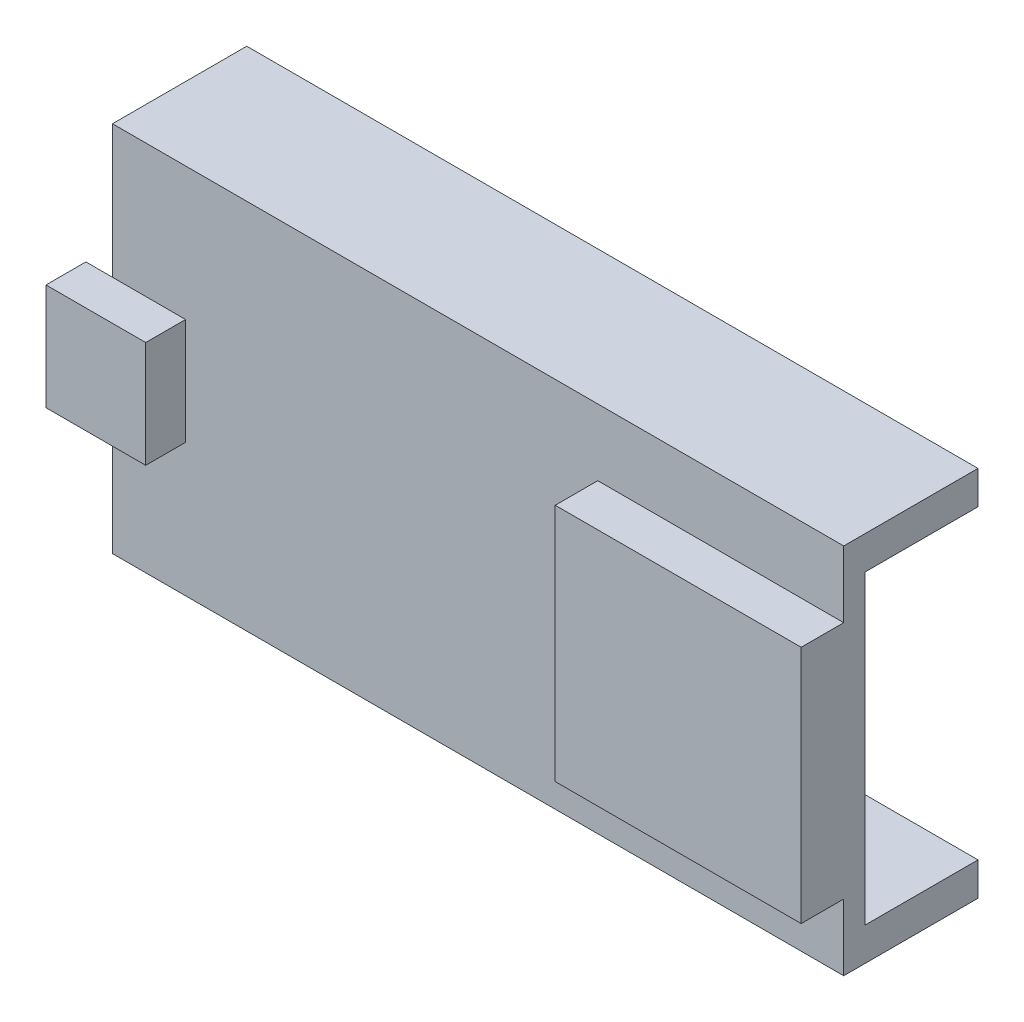
ISO-10303-21;
HEADER;
FILE_DESCRIPTION(('STEP AP214'),'2;1');
FILE_NAME('part.step','',(''),(''),'','','');
FILE_SCHEMA(('AUTOMOTIVE_DESIGN { 1 0 10303 214 1 1 1 1 }'));
ENDSEC;
DATA;
#1=APPLICATION_CONTEXT('core data for automotive mechanical design processes');
#2=APPLICATION_PROTOCOL_DEFINITION('international standard','automotive_design',2000,#1);
#3=PRODUCT_CONTEXT('',#1,'mechanical');
#4=PRODUCT('Part','Part','',(#3));
#5=PRODUCT_RELATED_PRODUCT_CATEGORY('part','',(#4));
#6=PRODUCT_DEFINITION_FORMATION('','',#4);
#7=PRODUCT_DEFINITION_CONTEXT('part definition',#1,'design');
#8=PRODUCT_DEFINITION('design','',#6,#7);
#9=PRODUCT_DEFINITION_SHAPE('','',#8);
#10=(LENGTH_UNIT() NAMED_UNIT(*) SI_UNIT(.MILLI.,.METRE.));
#11=(NAMED_UNIT(*) PLANE_ANGLE_UNIT() SI_UNIT($,.RADIAN.));
#12=(NAMED_UNIT(*) SI_UNIT($,.STERADIAN.) SOLID_ANGLE_UNIT());
#13=UNCERTAINTY_MEASURE_WITH_UNIT(LENGTH_MEASURE(1.E-05),#10,'distance_accuracy_value','');
#14=(GEOMETRIC_REPRESENTATION_CONTEXT(3) GLOBAL_UNCERTAINTY_ASSIGNED_CONTEXT((#13)) GLOBAL_UNIT_ASSIGNED_CONTEXT((#10,
#11,#12)) REPRESENTATION_CONTEXT('',''));
#15=CARTESIAN_POINT('',(0.,0.,0.));
#16=DIRECTION('',(0.,0.,1.));
#17=DIRECTION('',(1.,0.,0.));
#18=AXIS2_PLACEMENT_3D('',#15,#16,#17);
#19=CARTESIAN_POINT('',(-27.5,14.,1.6));
#20=DIRECTION('',(1.,0.,0.));
#21=DIRECTION('',(0.,0.,-1.));
#22=AXIS2_PLACEMENT_3D('',#19,#20,#21);
#23=PLANE('',#22);
#24=DIRECTION('',(0.,0.,-1.));
#25=VECTOR('',#24,1.);
#26=CARTESIAN_POINT('',(-27.5,14.,1.6));
#27=LINE('',#26,#25);
#28=CARTESIAN_POINT('',(-27.5,14.,1.6));
#29=VERTEX_POINT('',#28);
#30=CARTESIAN_POINT('',(-27.5,14.,-8.5));
#31=VERTEX_POINT('',#30);
#32=EDGE_CURVE('E264',#29,#31,#27,.T.);
#33=ORIENTED_EDGE('',*,*,#32,.T.);
#34=DIRECTION('',(0.,-1.,0.));
#35=VECTOR('',#34,1.);
#36=CARTESIAN_POINT('',(-27.5,14.,-8.5));
#37=LINE('',#36,#35);
#38=CARTESIAN_POINT('',(-27.5,11.5,-8.5));
#39=VERTEX_POINT('',#38);
#40=EDGE_CURVE('E213',#31,#39,#37,.T.);
#41=ORIENTED_EDGE('',*,*,#40,.T.);
#42=DIRECTION('',(0.,0.,-1.));
#43=VECTOR('',#42,1.);
#44=CARTESIAN_POINT('',(-27.5,11.5,0.));
#45=LINE('',#44,#43);
#46=CARTESIAN_POINT('',(-27.5,11.5,0.));
#47=VERTEX_POINT('',#46);
#48=EDGE_CURVE('E229',#47,#39,#45,.T.);
#49=ORIENTED_EDGE('',*,*,#48,.F.);
#50=DIRECTION('',(0.,-1.,0.));
#51=VECTOR('',#50,1.);
#52=CARTESIAN_POINT('',(-27.5,14.,0.));
#53=LINE('',#52,#51);
#54=CARTESIAN_POINT('',(-27.5,-11.5,0.));
#55=VERTEX_POINT('',#54);
#56=EDGE_CURVE('E252',#47,#55,#53,.T.);
#57=ORIENTED_EDGE('',*,*,#56,.T.);
#58=DIRECTION('',(0.,0.,-1.));
#59=VECTOR('',#58,1.);
#60=CARTESIAN_POINT('',(-27.5,-11.5,0.));
#61=LINE('',#60,#59);
#62=CARTESIAN_POINT('',(-27.5,-11.5,-8.5));
#63=VERTEX_POINT('',#62);
#64=EDGE_CURVE('E240',#55,#63,#61,.T.);
#65=ORIENTED_EDGE('',*,*,#64,.T.);
#66=DIRECTION('',(0.,-1.,0.));
#67=VECTOR('',#66,1.);
#68=CARTESIAN_POINT('',(-27.5,-11.5,-8.5));
#69=LINE('',#68,#67);
#70=CARTESIAN_POINT('',(-27.5,-14.,-8.5));
#71=VERTEX_POINT('',#70);
#72=EDGE_CURVE('E234',#63,#71,#69,.T.);
#73=ORIENTED_EDGE('',*,*,#72,.T.);
#74=DIRECTION('',(0.,0.,-1.));
#75=VECTOR('',#74,1.);
#76=CARTESIAN_POINT('',(-27.5,-14.,1.6));
#77=LINE('',#76,#75);
#78=CARTESIAN_POINT('',(-27.5,-14.,1.6));
#79=VERTEX_POINT('',#78);
#80=EDGE_CURVE('E45',#79,#71,#77,.T.);
#81=ORIENTED_EDGE('',*,*,#80,.F.);
#82=DIRECTION('',(0.,-1.,0.));
#83=VECTOR('',#82,1.);
#84=CARTESIAN_POINT('',(-27.5,14.,1.6));
#85=LINE('',#84,#83);
#86=CARTESIAN_POINT('',(-27.5,-4.,1.6));
#87=VERTEX_POINT('',#86);
#88=EDGE_CURVE('E256',#87,#79,#85,.T.);
#89=ORIENTED_EDGE('',*,*,#88,.F.);
#90=CARTESIAN_POINT('',(-27.5,4.,1.6));
#91=VERTEX_POINT('',#90);
#92=EDGE_CURVE('E260',#91,#87,#85,.T.);
#93=ORIENTED_EDGE('',*,*,#92,.F.);
#94=EDGE_CURVE('E251',#29,#91,#85,.T.);
#95=ORIENTED_EDGE('',*,*,#94,.F.);
#96=EDGE_LOOP('',(#33,#41,#49,#57,#65,#73,#81,#89,#93,#95));
#97=FACE_BOUND('',#96,.T.);
#98=ADVANCED_FACE('F39',(#97),#23,.F.);
#99=CARTESIAN_POINT('',(-27.5,-14.,1.6));
#100=DIRECTION('',(0.,1.,0.));
#101=DIRECTION('',(0.,0.,1.));
#102=AXIS2_PLACEMENT_3D('',#99,#100,#101);
#103=PLANE('',#102);
#104=ORIENTED_EDGE('',*,*,#80,.T.);
#105=DIRECTION('',(1.,0.,0.));
#106=VECTOR('',#105,1.);
#107=CARTESIAN_POINT('',(-27.5,-14.,-8.5));
#108=LINE('',#107,#106);
#109=CARTESIAN_POINT('',(27.5,-14.,-8.5));
#110=VERTEX_POINT('',#109);
#111=EDGE_CURVE('E241',#71,#110,#108,.T.);
#112=ORIENTED_EDGE('',*,*,#111,.T.);
#113=DIRECTION('',(0.,0.,-1.));
#114=VECTOR('',#113,1.);
#115=CARTESIAN_POINT('',(27.5,-14.,1.6));
#116=LINE('',#115,#114);
#117=CARTESIAN_POINT('',(27.5,-14.,1.6));
#118=VERTEX_POINT('',#117);
#119=EDGE_CURVE('E275',#118,#110,#116,.T.);
#120=ORIENTED_EDGE('',*,*,#119,.F.);
#121=DIRECTION('',(1.,0.,0.));
#122=VECTOR('',#121,1.);
#123=CARTESIAN_POINT('',(-27.5,-14.,1.6));
#124=LINE('',#123,#122);
#125=EDGE_CURVE('E258',#79,#118,#124,.T.);
#126=ORIENTED_EDGE('',*,*,#125,.F.);
#127=EDGE_LOOP('',(#104,#112,#120,#126));
#128=FACE_BOUND('',#127,.T.);
#129=ADVANCED_FACE('F278',(#128),#103,.F.);
#130=CARTESIAN_POINT('',(27.5,-14.,1.6));
#131=DIRECTION('',(-1.,0.,0.));
#132=DIRECTION('',(0.,0.,1.));
#133=AXIS2_PLACEMENT_3D('',#130,#131,#132);
#134=PLANE('',#133);
#135=ORIENTED_EDGE('',*,*,#119,.T.);
#136=DIRECTION('',(0.,1.,0.));
#137=VECTOR('',#136,1.);
#138=CARTESIAN_POINT('',(27.5,-14.,-8.5));
#139=LINE('',#138,#137);
#140=CARTESIAN_POINT('',(27.5,-11.5,-8.5));
#141=VERTEX_POINT('',#140);
#142=EDGE_CURVE('E243',#110,#141,#139,.T.);
#143=ORIENTED_EDGE('',*,*,#142,.T.);
#144=DIRECTION('',(0.,0.,-1.));
#145=VECTOR('',#144,1.);
#146=CARTESIAN_POINT('',(27.5,-11.5,0.));
#147=LINE('',#146,#145);
#148=CARTESIAN_POINT('',(27.5,-11.5,0.));
#149=VERTEX_POINT('',#148);
#150=EDGE_CURVE('E246',#149,#141,#147,.T.);
#151=ORIENTED_EDGE('',*,*,#150,.F.);
#152=DIRECTION('',(0.,1.,0.));
#153=VECTOR('',#152,1.);
#154=CARTESIAN_POINT('',(27.5,-14.,0.));
#155=LINE('',#154,#153);
#156=CARTESIAN_POINT('',(27.5,11.5,0.));
#157=VERTEX_POINT('',#156);
#158=EDGE_CURVE('E270',#149,#157,#155,.T.);
#159=ORIENTED_EDGE('',*,*,#158,.T.);
#160=DIRECTION('',(0.,0.,-1.));
#161=VECTOR('',#160,1.);
#162=CARTESIAN_POINT('',(27.5,11.5,0.));
#163=LINE('',#162,#161);
#164=CARTESIAN_POINT('',(27.5,11.5,-8.5));
#165=VERTEX_POINT('',#164);
#166=EDGE_CURVE('E220',#157,#165,#163,.T.);
#167=ORIENTED_EDGE('',*,*,#166,.T.);
#168=DIRECTION('',(0.,1.,0.));
#169=VECTOR('',#168,1.);
#170=CARTESIAN_POINT('',(27.5,11.5,-8.5));
#171=LINE('',#170,#169);
#172=CARTESIAN_POINT('',(27.5,14.,-8.5));
#173=VERTEX_POINT('',#172);
#174=EDGE_CURVE('E224',#165,#173,#171,.T.);
#175=ORIENTED_EDGE('',*,*,#174,.T.);
#176=DIRECTION('',(0.,0.,-1.));
#177=VECTOR('',#176,1.);
#178=CARTESIAN_POINT('',(27.5,14.,1.6));
#179=LINE('',#178,#177);
#180=CARTESIAN_POINT('',(27.5,14.,1.6));
#181=VERTEX_POINT('',#180);
#182=EDGE_CURVE('E271',#181,#173,#179,.T.);
#183=ORIENTED_EDGE('',*,*,#182,.F.);
#184=DIRECTION('',(0.,1.,0.));
#185=VECTOR('',#184,1.);
#186=CARTESIAN_POINT('',(27.5,-14.,1.6));
#187=LINE('',#186,#185);
#188=CARTESIAN_POINT('',(27.5,9.,1.6));
#189=VERTEX_POINT('',#188);
#190=EDGE_CURVE('E257',#189,#181,#187,.T.);
#191=ORIENTED_EDGE('',*,*,#190,.F.);
#192=DIRECTION('',(0.,0.,-1.));
#193=VECTOR('',#192,1.);
#194=CARTESIAN_POINT('',(27.5,9.,4.8));
#195=LINE('',#194,#193);
#196=CARTESIAN_POINT('',(27.5,9.,4.8));
#197=VERTEX_POINT('',#196);
#198=EDGE_CURVE('E204',#197,#189,#195,.T.);
#199=ORIENTED_EDGE('',*,*,#198,.F.);
#200=DIRECTION('',(0.,1.,0.));
#201=VECTOR('',#200,1.);
#202=CARTESIAN_POINT('',(27.5,-9.,4.8));
#203=LINE('',#202,#201);
#204=CARTESIAN_POINT('',(27.5,-9.,4.8));
#205=VERTEX_POINT('',#204);
#206=EDGE_CURVE('E191',#205,#197,#203,.T.);
#207=ORIENTED_EDGE('',*,*,#206,.F.);
#208=DIRECTION('',(0.,0.,-1.));
#209=VECTOR('',#208,1.);
#210=CARTESIAN_POINT('',(27.5,-9.,4.8));
#211=LINE('',#210,#209);
#212=CARTESIAN_POINT('',(27.5,-9.,1.6));
#213=VERTEX_POINT('',#212);
#214=EDGE_CURVE('E210',#205,#213,#211,.T.);
#215=ORIENTED_EDGE('',*,*,#214,.T.);
#216=EDGE_CURVE('E261',#118,#213,#187,.T.);
#217=ORIENTED_EDGE('',*,*,#216,.F.);
#218=EDGE_LOOP('',(#135,#143,#151,#159,#167,#175,#183,#191,#199,#207,#215,#217));
#219=FACE_BOUND('',#218,.T.);
#220=ADVANCED_FACE('F300',(#219),#134,.F.);
#221=CARTESIAN_POINT('',(27.5,14.,1.6));
#222=DIRECTION('',(0.,-1.,0.));
#223=DIRECTION('',(0.,0.,-1.));
#224=AXIS2_PLACEMENT_3D('',#221,#222,#223);
#225=PLANE('',#224);
#226=ORIENTED_EDGE('',*,*,#182,.T.);
#227=DIRECTION('',(-1.,0.,0.));
#228=VECTOR('',#227,1.);
#229=CARTESIAN_POINT('',(27.5,14.,-8.5));
#230=LINE('',#229,#228);
#231=EDGE_CURVE('E217',#173,#31,#230,.T.);
#232=ORIENTED_EDGE('',*,*,#231,.T.);
#233=ORIENTED_EDGE('',*,*,#32,.F.);
#234=DIRECTION('',(-1.,0.,0.));
#235=VECTOR('',#234,1.);
#236=CARTESIAN_POINT('',(27.5,14.,1.6));
#237=LINE('',#236,#235);
#238=EDGE_CURVE('E263',#181,#29,#237,.T.);
#239=ORIENTED_EDGE('',*,*,#238,.F.);
#240=EDGE_LOOP('',(#226,#232,#233,#239));
#241=FACE_BOUND('',#240,.T.);
#242=ADVANCED_FACE('F307',(#241),#225,.F.);
#243=CARTESIAN_POINT('',(0.,0.,1.6));
#244=DIRECTION('',(0.,0.,1.));
#245=DIRECTION('',(1.,0.,0.));
#246=AXIS2_PLACEMENT_3D('',#243,#244,#245);
#247=PLANE('',#246);
#248=DIRECTION('',(-1.,0.,0.));
#249=VECTOR('',#248,1.);
#250=CARTESIAN_POINT('',(-22.,4.,1.6));
#251=LINE('',#250,#249);
#252=CARTESIAN_POINT('',(-22.,4.,1.6));
#253=VERTEX_POINT('',#252);
#254=EDGE_CURVE('E177',#253,#91,#251,.T.);
#255=ORIENTED_EDGE('',*,*,#254,.F.);
#256=DIRECTION('',(0.,1.,0.));
#257=VECTOR('',#256,1.);
#258=CARTESIAN_POINT('',(-22.,-4.,1.6));
#259=LINE('',#258,#257);
#260=CARTESIAN_POINT('',(-22.,-4.,1.6));
#261=VERTEX_POINT('',#260);
#262=EDGE_CURVE('E334',#261,#253,#259,.T.);
#263=ORIENTED_EDGE('',*,*,#262,.F.);
#264=DIRECTION('',(1.,0.,0.));
#265=VECTOR('',#264,1.);
#266=CARTESIAN_POINT('',(-29.5,-4.,1.6));
#267=LINE('',#266,#265);
#268=EDGE_CURVE('E11',#87,#261,#267,.T.);
#269=ORIENTED_EDGE('',*,*,#268,.F.);
#270=ORIENTED_EDGE('',*,*,#88,.T.);
#271=ORIENTED_EDGE('',*,*,#125,.T.);
#272=ORIENTED_EDGE('',*,*,#216,.T.);
#273=DIRECTION('',(1.,0.,0.));
#274=VECTOR('',#273,1.);
#275=CARTESIAN_POINT('',(9.,-9.,1.6));
#276=LINE('',#275,#274);
#277=CARTESIAN_POINT('',(9.,-9.,1.6));
#278=VERTEX_POINT('',#277);
#279=EDGE_CURVE('E185',#278,#213,#276,.T.);
#280=ORIENTED_EDGE('',*,*,#279,.F.);
#281=DIRECTION('',(0.,-1.,0.));
#282=VECTOR('',#281,1.);
#283=CARTESIAN_POINT('',(9.,9.,1.6));
#284=LINE('',#283,#282);
#285=CARTESIAN_POINT('',(9.,9.,1.6));
#286=VERTEX_POINT('',#285);
#287=EDGE_CURVE('E65',#286,#278,#284,.T.);
#288=ORIENTED_EDGE('',*,*,#287,.F.);
#289=DIRECTION('',(-1.,0.,0.));
#290=VECTOR('',#289,1.);
#291=CARTESIAN_POINT('',(27.5,9.,1.6));
#292=LINE('',#291,#290);
#293=EDGE_CURVE('E195',#189,#286,#292,.T.);
#294=ORIENTED_EDGE('',*,*,#293,.F.);
#295=ORIENTED_EDGE('',*,*,#190,.T.);
#296=ORIENTED_EDGE('',*,*,#238,.T.);
#297=ORIENTED_EDGE('',*,*,#94,.T.);
#298=EDGE_LOOP('',(#255,#263,#269,#270,#271,#272,#280,#288,#294,#295,#296,#297));
#299=FACE_BOUND('',#298,.T.);
#300=ADVANCED_FACE('F324',(#299),#247,.T.);
#301=CARTESIAN_POINT('',(0.,0.,0.));
#302=DIRECTION('',(0.,0.,1.));
#303=DIRECTION('',(1.,0.,0.));
#304=AXIS2_PLACEMENT_3D('',#301,#302,#303);
#305=PLANE('',#304);
#306=ORIENTED_EDGE('',*,*,#56,.F.);
#307=DIRECTION('',(1.,0.,0.));
#308=VECTOR('',#307,1.);
#309=CARTESIAN_POINT('',(-27.5,11.5,0.));
#310=LINE('',#309,#308);
#311=EDGE_CURVE('E212',#47,#157,#310,.T.);
#312=ORIENTED_EDGE('',*,*,#311,.T.);
#313=ORIENTED_EDGE('',*,*,#158,.F.);
#314=DIRECTION('',(-1.,0.,0.));
#315=VECTOR('',#314,1.);
#316=CARTESIAN_POINT('',(27.5,-11.5,0.));
#317=LINE('',#316,#315);
#318=EDGE_CURVE('E231',#149,#55,#317,.T.);
#319=ORIENTED_EDGE('',*,*,#318,.T.);
#320=EDGE_LOOP('',(#306,#312,#313,#319));
#321=FACE_BOUND('',#320,.T.);
#322=ADVANCED_FACE('F296',(#321),#305,.F.);
#323=CARTESIAN_POINT('',(27.5,-11.5,0.));
#324=DIRECTION('',(0.,-1.,0.));
#325=DIRECTION('',(0.,0.,-1.));
#326=AXIS2_PLACEMENT_3D('',#323,#324,#325);
#327=PLANE('',#326);
#328=DIRECTION('',(-1.,0.,0.));
#329=VECTOR('',#328,1.);
#330=CARTESIAN_POINT('',(27.5,-11.5,-8.5));
#331=LINE('',#330,#329);
#332=EDGE_CURVE('E236',#141,#63,#331,.T.);
#333=ORIENTED_EDGE('',*,*,#332,.T.);
#334=ORIENTED_EDGE('',*,*,#64,.F.);
#335=ORIENTED_EDGE('',*,*,#318,.F.);
#336=ORIENTED_EDGE('',*,*,#150,.T.);
#337=EDGE_LOOP('',(#333,#334,#335,#336));
#338=FACE_BOUND('',#337,.T.);
#339=ADVANCED_FACE('F291',(#338),#327,.F.);
#340=CARTESIAN_POINT('',(0.,0.,-8.5));
#341=DIRECTION('',(0.,0.,1.));
#342=DIRECTION('',(1.,0.,0.));
#343=AXIS2_PLACEMENT_3D('',#340,#341,#342);
#344=PLANE('',#343);
#345=ORIENTED_EDGE('',*,*,#72,.F.);
#346=ORIENTED_EDGE('',*,*,#332,.F.);
#347=ORIENTED_EDGE('',*,*,#142,.F.);
#348=ORIENTED_EDGE('',*,*,#111,.F.);
#349=EDGE_LOOP('',(#345,#346,#347,#348));
#350=FACE_BOUND('',#349,.T.);
#351=ADVANCED_FACE('F287',(#350),#344,.F.);
#352=CARTESIAN_POINT('',(-27.5,11.5,0.));
#353=DIRECTION('',(0.,1.,0.));
#354=DIRECTION('',(0.,0.,1.));
#355=AXIS2_PLACEMENT_3D('',#352,#353,#354);
#356=PLANE('',#355);
#357=DIRECTION('',(1.,0.,0.));
#358=VECTOR('',#357,1.);
#359=CARTESIAN_POINT('',(-27.5,11.5,-8.5));
#360=LINE('',#359,#358);
#361=EDGE_CURVE('E222',#39,#165,#360,.T.);
#362=ORIENTED_EDGE('',*,*,#361,.T.);
#363=ORIENTED_EDGE('',*,*,#166,.F.);
#364=ORIENTED_EDGE('',*,*,#311,.F.);
#365=ORIENTED_EDGE('',*,*,#48,.T.);
#366=EDGE_LOOP('',(#362,#363,#364,#365));
#367=FACE_BOUND('',#366,.T.);
#368=ADVANCED_FACE('F341',(#367),#356,.F.);
#369=CARTESIAN_POINT('',(0.,0.,-8.5));
#370=DIRECTION('',(0.,0.,1.));
#371=DIRECTION('',(1.,0.,0.));
#372=AXIS2_PLACEMENT_3D('',#369,#370,#371);
#373=PLANE('',#372);
#374=ORIENTED_EDGE('',*,*,#40,.F.);
#375=ORIENTED_EDGE('',*,*,#231,.F.);
#376=ORIENTED_EDGE('',*,*,#174,.F.);
#377=ORIENTED_EDGE('',*,*,#361,.F.);
#378=EDGE_LOOP('',(#374,#375,#376,#377));
#379=FACE_BOUND('',#378,.T.);
#380=ADVANCED_FACE('F301',(#379),#373,.F.);
#381=CARTESIAN_POINT('',(9.,9.,4.8));
#382=DIRECTION('',(1.,0.,0.));
#383=DIRECTION('',(0.,0.,-1.));
#384=AXIS2_PLACEMENT_3D('',#381,#382,#383);
#385=PLANE('',#384);
#386=ORIENTED_EDGE('',*,*,#287,.T.);
#387=DIRECTION('',(0.,0.,-1.));
#388=VECTOR('',#387,1.);
#389=CARTESIAN_POINT('',(9.,-9.,4.8));
#390=LINE('',#389,#388);
#391=CARTESIAN_POINT('',(9.,-9.,4.8));
#392=VERTEX_POINT('',#391);
#393=EDGE_CURVE('E209',#392,#278,#390,.T.);
#394=ORIENTED_EDGE('',*,*,#393,.F.);
#395=DIRECTION('',(0.,-1.,0.));
#396=VECTOR('',#395,1.);
#397=CARTESIAN_POINT('',(9.,9.,4.8));
#398=LINE('',#397,#396);
#399=CARTESIAN_POINT('',(9.,9.,4.8));
#400=VERTEX_POINT('',#399);
#401=EDGE_CURVE('E187',#400,#392,#398,.T.);
#402=ORIENTED_EDGE('',*,*,#401,.F.);
#403=DIRECTION('',(0.,0.,-1.));
#404=VECTOR('',#403,1.);
#405=CARTESIAN_POINT('',(9.,9.,4.8));
#406=LINE('',#405,#404);
#407=EDGE_CURVE('E197',#400,#286,#406,.T.);
#408=ORIENTED_EDGE('',*,*,#407,.T.);
#409=EDGE_LOOP('',(#386,#394,#402,#408));
#410=FACE_BOUND('',#409,.T.);
#411=ADVANCED_FACE('F351',(#410),#385,.F.);
#412=CARTESIAN_POINT('',(9.,-9.,4.8));
#413=DIRECTION('',(0.,1.,0.));
#414=DIRECTION('',(0.,0.,1.));
#415=AXIS2_PLACEMENT_3D('',#412,#413,#414);
#416=PLANE('',#415);
#417=ORIENTED_EDGE('',*,*,#279,.T.);
#418=ORIENTED_EDGE('',*,*,#214,.F.);
#419=DIRECTION('',(1.,0.,0.));
#420=VECTOR('',#419,1.);
#421=CARTESIAN_POINT('',(9.,-9.,4.8));
#422=LINE('',#421,#420);
#423=EDGE_CURVE('E192',#392,#205,#422,.T.);
#424=ORIENTED_EDGE('',*,*,#423,.F.);
#425=ORIENTED_EDGE('',*,*,#393,.T.);
#426=EDGE_LOOP('',(#417,#418,#424,#425));
#427=FACE_BOUND('',#426,.T.);
#428=ADVANCED_FACE('F323',(#427),#416,.F.);
#429=CARTESIAN_POINT('',(27.5,9.,4.8));
#430=DIRECTION('',(0.,-1.,0.));
#431=DIRECTION('',(0.,0.,-1.));
#432=AXIS2_PLACEMENT_3D('',#429,#430,#431);
#433=PLANE('',#432);
#434=ORIENTED_EDGE('',*,*,#293,.T.);
#435=ORIENTED_EDGE('',*,*,#407,.F.);
#436=DIRECTION('',(-1.,0.,0.));
#437=VECTOR('',#436,1.);
#438=CARTESIAN_POINT('',(27.5,9.,4.8));
#439=LINE('',#438,#437);
#440=EDGE_CURVE('E198',#197,#400,#439,.T.);
#441=ORIENTED_EDGE('',*,*,#440,.F.);
#442=ORIENTED_EDGE('',*,*,#198,.T.);
#443=EDGE_LOOP('',(#434,#435,#441,#442));
#444=FACE_BOUND('',#443,.T.);
#445=ADVANCED_FACE('F312',(#444),#433,.F.);
#446=CARTESIAN_POINT('',(0.,0.,4.8));
#447=DIRECTION('',(0.,0.,1.));
#448=DIRECTION('',(1.,0.,0.));
#449=AXIS2_PLACEMENT_3D('',#446,#447,#448);
#450=PLANE('',#449);
#451=ORIENTED_EDGE('',*,*,#401,.T.);
#452=ORIENTED_EDGE('',*,*,#423,.T.);
#453=ORIENTED_EDGE('',*,*,#206,.T.);
#454=ORIENTED_EDGE('',*,*,#440,.T.);
#455=EDGE_LOOP('',(#451,#452,#453,#454));
#456=FACE_BOUND('',#455,.T.);
#457=ADVANCED_FACE('F317',(#456),#450,.T.);
#458=CARTESIAN_POINT('',(0.,0.,1.6));
#459=DIRECTION('',(0.,0.,1.));
#460=DIRECTION('',(1.,0.,0.));
#461=AXIS2_PLACEMENT_3D('',#458,#459,#460);
#462=PLANE('',#461);
#463=CARTESIAN_POINT('',(-29.5,4.,1.6));
#464=VERTEX_POINT('',#463);
#465=EDGE_CURVE('E332',#91,#464,#251,.T.);
#466=ORIENTED_EDGE('',*,*,#465,.F.);
#467=ORIENTED_EDGE('',*,*,#92,.T.);
#468=CARTESIAN_POINT('',(-29.5,-4.,1.6));
#469=VERTEX_POINT('',#468);
#470=EDGE_CURVE('E48',#469,#87,#267,.T.);
#471=ORIENTED_EDGE('',*,*,#470,.F.);
#472=DIRECTION('',(0.,-1.,0.));
#473=VECTOR('',#472,1.);
#474=CARTESIAN_POINT('',(-29.5,4.,1.6));
#475=LINE('',#474,#473);
#476=EDGE_CURVE('E178',#464,#469,#475,.T.);
#477=ORIENTED_EDGE('',*,*,#476,.F.);
#478=EDGE_LOOP('',(#466,#467,#471,#477));
#479=FACE_BOUND('',#478,.T.);
#480=ADVANCED_FACE('F329',(#479),#462,.F.);
#481=CARTESIAN_POINT('',(-29.5,4.,4.6));
#482=DIRECTION('',(1.,0.,0.));
#483=DIRECTION('',(0.,0.,-1.));
#484=AXIS2_PLACEMENT_3D('',#481,#482,#483);
#485=PLANE('',#484);
#486=ORIENTED_EDGE('',*,*,#476,.T.);
#487=DIRECTION('',(0.,0.,-1.));
#488=VECTOR('',#487,1.);
#489=CARTESIAN_POINT('',(-29.5,-4.,4.6));
#490=LINE('',#489,#488);
#491=CARTESIAN_POINT('',(-29.5,-4.,4.6));
#492=VERTEX_POINT('',#491);
#493=EDGE_CURVE('E162',#492,#469,#490,.T.);
#494=ORIENTED_EDGE('',*,*,#493,.F.);
#495=DIRECTION('',(0.,-1.,0.));
#496=VECTOR('',#495,1.);
#497=CARTESIAN_POINT('',(-29.5,4.,4.6));
#498=LINE('',#497,#496);
#499=CARTESIAN_POINT('',(-29.5,4.,4.6));
#500=VERTEX_POINT('',#499);
#501=EDGE_CURVE('E170',#500,#492,#498,.T.);
#502=ORIENTED_EDGE('',*,*,#501,.F.);
#503=DIRECTION('',(0.,0.,-1.));
#504=VECTOR('',#503,1.);
#505=CARTESIAN_POINT('',(-29.5,4.,4.6));
#506=LINE('',#505,#504);
#507=EDGE_CURVE('E338',#500,#464,#506,.T.);
#508=ORIENTED_EDGE('',*,*,#507,.T.);
#509=EDGE_LOOP('',(#486,#494,#502,#508));
#510=FACE_BOUND('',#509,.T.);
#511=ADVANCED_FACE('F179',(#510),#485,.F.);
#512=CARTESIAN_POINT('',(-29.5,-4.,4.6));
#513=DIRECTION('',(0.,1.,0.));
#514=DIRECTION('',(0.,0.,1.));
#515=AXIS2_PLACEMENT_3D('',#512,#513,#514);
#516=PLANE('',#515);
#517=ORIENTED_EDGE('',*,*,#470,.T.);
#518=ORIENTED_EDGE('',*,*,#268,.T.);
#519=DIRECTION('',(0.,0.,-1.));
#520=VECTOR('',#519,1.);
#521=CARTESIAN_POINT('',(-22.,-4.,4.6));
#522=LINE('',#521,#520);
#523=CARTESIAN_POINT('',(-22.,-4.,4.6));
#524=VERTEX_POINT('',#523);
#525=EDGE_CURVE('E54',#524,#261,#522,.T.);
#526=ORIENTED_EDGE('',*,*,#525,.F.);
#527=DIRECTION('',(1.,0.,0.));
#528=VECTOR('',#527,1.);
#529=CARTESIAN_POINT('',(-29.5,-4.,4.6));
#530=LINE('',#529,#528);
#531=EDGE_CURVE('E158',#492,#524,#530,.T.);
#532=ORIENTED_EDGE('',*,*,#531,.F.);
#533=ORIENTED_EDGE('',*,*,#493,.T.);
#534=EDGE_LOOP('',(#517,#518,#526,#532,#533));
#535=FACE_BOUND('',#534,.T.);
#536=ADVANCED_FACE('F161',(#535),#516,.F.);
#537=CARTESIAN_POINT('',(-22.,-4.,4.6));
#538=DIRECTION('',(-1.,0.,0.));
#539=DIRECTION('',(0.,0.,1.));
#540=AXIS2_PLACEMENT_3D('',#537,#538,#539);
#541=PLANE('',#540);
#542=ORIENTED_EDGE('',*,*,#262,.T.);
#543=DIRECTION('',(0.,0.,-1.));
#544=VECTOR('',#543,1.);
#545=CARTESIAN_POINT('',(-22.,4.,4.6));
#546=LINE('',#545,#544);
#547=CARTESIAN_POINT('',(-22.,4.,4.6));
#548=VERTEX_POINT('',#547);
#549=EDGE_CURVE('E184',#548,#253,#546,.T.);
#550=ORIENTED_EDGE('',*,*,#549,.F.);
#551=DIRECTION('',(0.,1.,0.));
#552=VECTOR('',#551,1.);
#553=CARTESIAN_POINT('',(-22.,-4.,4.6));
#554=LINE('',#553,#552);
#555=EDGE_CURVE('E167',#524,#548,#554,.T.);
#556=ORIENTED_EDGE('',*,*,#555,.F.);
#557=ORIENTED_EDGE('',*,*,#525,.T.);
#558=EDGE_LOOP('',(#542,#550,#556,#557));
#559=FACE_BOUND('',#558,.T.);
#560=ADVANCED_FACE('F483',(#559),#541,.F.);
#561=CARTESIAN_POINT('',(-22.,4.,4.6));
#562=DIRECTION('',(0.,-1.,0.));
#563=DIRECTION('',(0.,0.,-1.));
#564=AXIS2_PLACEMENT_3D('',#561,#562,#563);
#565=PLANE('',#564);
#566=ORIENTED_EDGE('',*,*,#254,.T.);
#567=ORIENTED_EDGE('',*,*,#465,.T.);
#568=ORIENTED_EDGE('',*,*,#507,.F.);
#569=DIRECTION('',(-1.,0.,0.));
#570=VECTOR('',#569,1.);
#571=CARTESIAN_POINT('',(-22.,4.,4.6));
#572=LINE('',#571,#570);
#573=EDGE_CURVE('E175',#548,#500,#572,.T.);
#574=ORIENTED_EDGE('',*,*,#573,.F.);
#575=ORIENTED_EDGE('',*,*,#549,.T.);
#576=EDGE_LOOP('',(#566,#567,#568,#574,#575));
#577=FACE_BOUND('',#576,.T.);
#578=ADVANCED_FACE('F344',(#577),#565,.F.);
#579=CARTESIAN_POINT('',(0.,0.,4.6));
#580=DIRECTION('',(0.,0.,1.));
#581=DIRECTION('',(1.,0.,0.));
#582=AXIS2_PLACEMENT_3D('',#579,#580,#581);
#583=PLANE('',#582);
#584=ORIENTED_EDGE('',*,*,#501,.T.);
#585=ORIENTED_EDGE('',*,*,#531,.T.);
#586=ORIENTED_EDGE('',*,*,#555,.T.);
#587=ORIENTED_EDGE('',*,*,#573,.T.);
#588=EDGE_LOOP('',(#584,#585,#586,#587));
#589=FACE_BOUND('',#588,.T.);
#590=ADVANCED_FACE('F168',(#589),#583,.T.);
#591=CLOSED_SHELL('',(#98,#129,#220,#242,#300,#322,#339,#351,#368,#380,#411,#428,#445,#457,#480,
#511,#536,#560,#578,#590));
#592=MANIFOLD_SOLID_BREP('B2',#591);
#593=ADVANCED_BREP_SHAPE_REPRESENTATION('',(#18,#592),#14);
#594=SHAPE_DEFINITION_REPRESENTATION(#9,#593);
ENDSEC;
END-ISO-10303-21;
